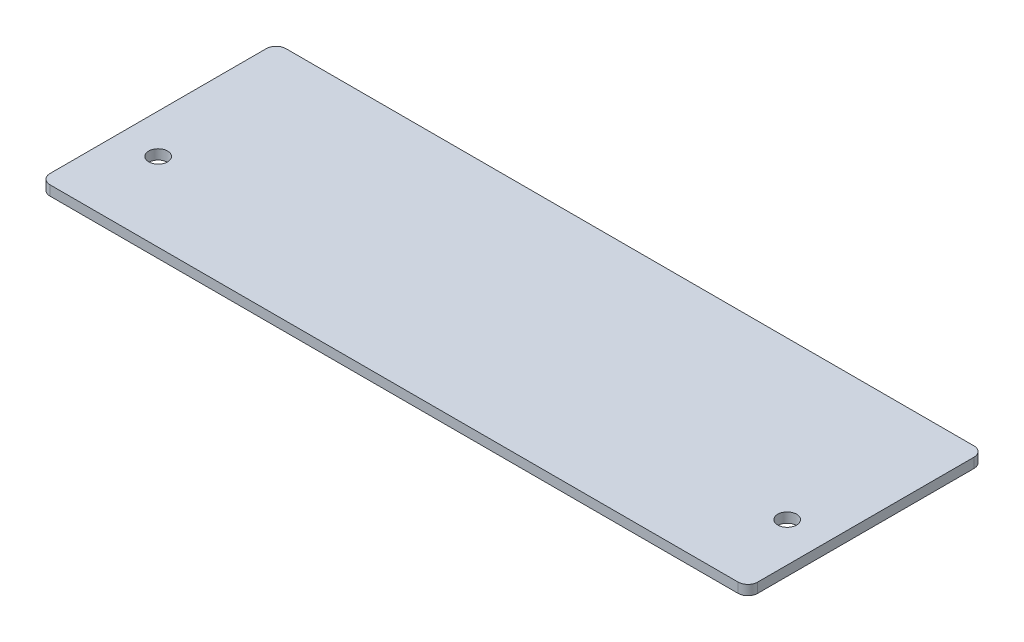
ISO-10303-21;
HEADER;
FILE_DESCRIPTION(('STEP AP214'),'2;1');
FILE_NAME('part.step','',(''),(''),'','','');
FILE_SCHEMA(('AUTOMOTIVE_DESIGN { 1 0 10303 214 1 1 1 1 }'));
ENDSEC;
DATA;
#1=APPLICATION_CONTEXT('core data for automotive mechanical design processes');
#2=APPLICATION_PROTOCOL_DEFINITION('international standard','automotive_design',2000,#1);
#3=PRODUCT_CONTEXT('',#1,'mechanical');
#4=PRODUCT('Part','Part','',(#3));
#5=PRODUCT_RELATED_PRODUCT_CATEGORY('part','',(#4));
#6=PRODUCT_DEFINITION_FORMATION('','',#4);
#7=PRODUCT_DEFINITION_CONTEXT('part definition',#1,'design');
#8=PRODUCT_DEFINITION('design','',#6,#7);
#9=PRODUCT_DEFINITION_SHAPE('','',#8);
#10=(LENGTH_UNIT() NAMED_UNIT(*) SI_UNIT(.MILLI.,.METRE.));
#11=(NAMED_UNIT(*) PLANE_ANGLE_UNIT() SI_UNIT($,.RADIAN.));
#12=(NAMED_UNIT(*) SI_UNIT($,.STERADIAN.) SOLID_ANGLE_UNIT());
#13=UNCERTAINTY_MEASURE_WITH_UNIT(LENGTH_MEASURE(1.E-05),#10,'distance_accuracy_value','');
#14=(GEOMETRIC_REPRESENTATION_CONTEXT(3) GLOBAL_UNCERTAINTY_ASSIGNED_CONTEXT((#13)) GLOBAL_UNIT_ASSIGNED_CONTEXT((#10,
#11,#12)) REPRESENTATION_CONTEXT('',''));
#15=CARTESIAN_POINT('',(0.,0.,0.));
#16=DIRECTION('',(0.,0.,1.));
#17=DIRECTION('',(1.,0.,0.));
#18=AXIS2_PLACEMENT_3D('',#15,#16,#17);
#19=CARTESIAN_POINT('',(-114.3,3.175,38.1));
#20=DIRECTION('',(1.,0.,0.));
#21=DIRECTION('',(0.,0.,-1.));
#22=AXIS2_PLACEMENT_3D('',#19,#20,#21);
#23=PLANE('',#22);
#24=DIRECTION('',(0.,0.,1.));
#25=VECTOR('',#24,1.);
#26=CARTESIAN_POINT('',(-114.3,3.175,38.1));
#27=LINE('',#26,#25);
#28=CARTESIAN_POINT('',(-114.3,3.175,-34.925));
#29=VERTEX_POINT('',#28);
#30=CARTESIAN_POINT('',(-114.3,3.175,34.925));
#31=VERTEX_POINT('',#30);
#32=EDGE_CURVE('E133',#29,#31,#27,.T.);
#33=ORIENTED_EDGE('',*,*,#32,.F.);
#34=DIRECTION('',(0.,-1.,0.));
#35=VECTOR('',#34,1.);
#36=CARTESIAN_POINT('',(-114.3,3.175,-34.925));
#37=LINE('',#36,#35);
#38=CARTESIAN_POINT('',(-114.3,0.,-34.925));
#39=VERTEX_POINT('',#38);
#40=EDGE_CURVE('E118',#29,#39,#37,.T.);
#41=ORIENTED_EDGE('',*,*,#40,.T.);
#42=DIRECTION('',(0.,0.,1.));
#43=VECTOR('',#42,1.);
#44=CARTESIAN_POINT('',(-114.3,0.,38.1));
#45=LINE('',#44,#43);
#46=CARTESIAN_POINT('',(-114.3,0.,34.925));
#47=VERTEX_POINT('',#46);
#48=EDGE_CURVE('E130',#39,#47,#45,.T.);
#49=ORIENTED_EDGE('',*,*,#48,.T.);
#50=DIRECTION('',(0.,-1.,0.));
#51=VECTOR('',#50,1.);
#52=CARTESIAN_POINT('',(-114.3,3.175,34.925));
#53=LINE('',#52,#51);
#54=EDGE_CURVE('E135',#47,#31,#53,.F.);
#55=ORIENTED_EDGE('',*,*,#54,.T.);
#56=EDGE_LOOP('',(#33,#41,#49,#55));
#57=FACE_BOUND('',#56,.T.);
#58=ADVANCED_FACE('F48',(#57),#23,.F.);
#59=CARTESIAN_POINT('',(114.3,3.175,38.1));
#60=DIRECTION('',(0.,0.,-1.));
#61=DIRECTION('',(-1.,0.,0.));
#62=AXIS2_PLACEMENT_3D('',#59,#60,#61);
#63=PLANE('',#62);
#64=DIRECTION('',(1.,0.,0.));
#65=VECTOR('',#64,1.);
#66=CARTESIAN_POINT('',(114.3,0.,38.1));
#67=LINE('',#66,#65);
#68=CARTESIAN_POINT('',(-111.125,0.,38.1));
#69=VERTEX_POINT('',#68);
#70=CARTESIAN_POINT('',(111.125,0.,38.1));
#71=VERTEX_POINT('',#70);
#72=EDGE_CURVE('E141',#69,#71,#67,.T.);
#73=ORIENTED_EDGE('',*,*,#72,.T.);
#74=DIRECTION('',(0.,-1.,0.));
#75=VECTOR('',#74,1.);
#76=CARTESIAN_POINT('',(111.125,3.175,38.1));
#77=LINE('',#76,#75);
#78=CARTESIAN_POINT('',(111.125,3.175,38.1));
#79=VERTEX_POINT('',#78);
#80=EDGE_CURVE('E12',#71,#79,#77,.F.);
#81=ORIENTED_EDGE('',*,*,#80,.T.);
#82=DIRECTION('',(1.,0.,0.));
#83=VECTOR('',#82,1.);
#84=CARTESIAN_POINT('',(114.3,3.175,38.1));
#85=LINE('',#84,#83);
#86=CARTESIAN_POINT('',(-111.125,3.175,38.1));
#87=VERTEX_POINT('',#86);
#88=EDGE_CURVE('E192',#87,#79,#85,.T.);
#89=ORIENTED_EDGE('',*,*,#88,.F.);
#90=DIRECTION('',(0.,-1.,0.));
#91=VECTOR('',#90,1.);
#92=CARTESIAN_POINT('',(-111.125,3.175,38.1));
#93=LINE('',#92,#91);
#94=EDGE_CURVE('E56',#87,#69,#93,.T.);
#95=ORIENTED_EDGE('',*,*,#94,.T.);
#96=EDGE_LOOP('',(#73,#81,#89,#95));
#97=FACE_BOUND('',#96,.T.);
#98=ADVANCED_FACE('F190',(#97),#63,.F.);
#99=CARTESIAN_POINT('',(114.3,3.175,38.1));
#100=DIRECTION('',(-1.,0.,0.));
#101=DIRECTION('',(0.,0.,1.));
#102=AXIS2_PLACEMENT_3D('',#99,#100,#101);
#103=PLANE('',#102);
#104=DIRECTION('',(0.,0.,-1.));
#105=VECTOR('',#104,1.);
#106=CARTESIAN_POINT('',(114.3,3.175,38.1));
#107=LINE('',#106,#105);
#108=CARTESIAN_POINT('',(114.3,3.175,34.925));
#109=VERTEX_POINT('',#108);
#110=CARTESIAN_POINT('',(114.3,3.175,-34.925));
#111=VERTEX_POINT('',#110);
#112=EDGE_CURVE('E200',#109,#111,#107,.T.);
#113=ORIENTED_EDGE('',*,*,#112,.F.);
#114=DIRECTION('',(0.,-1.,0.));
#115=VECTOR('',#114,1.);
#116=CARTESIAN_POINT('',(114.3,3.175,34.925));
#117=LINE('',#116,#115);
#118=CARTESIAN_POINT('',(114.3,0.,34.925));
#119=VERTEX_POINT('',#118);
#120=EDGE_CURVE('E184',#109,#119,#117,.T.);
#121=ORIENTED_EDGE('',*,*,#120,.T.);
#122=DIRECTION('',(0.,0.,-1.));
#123=VECTOR('',#122,1.);
#124=CARTESIAN_POINT('',(114.3,0.,38.1));
#125=LINE('',#124,#123);
#126=CARTESIAN_POINT('',(114.3,0.,-34.925));
#127=VERTEX_POINT('',#126);
#128=EDGE_CURVE('E148',#119,#127,#125,.T.);
#129=ORIENTED_EDGE('',*,*,#128,.T.);
#130=DIRECTION('',(0.,-1.,0.));
#131=VECTOR('',#130,1.);
#132=CARTESIAN_POINT('',(114.3,3.175,-34.925));
#133=LINE('',#132,#131);
#134=EDGE_CURVE('E63',#127,#111,#133,.F.);
#135=ORIENTED_EDGE('',*,*,#134,.T.);
#136=EDGE_LOOP('',(#113,#121,#129,#135));
#137=FACE_BOUND('',#136,.T.);
#138=ADVANCED_FACE('F199',(#137),#103,.F.);
#139=CARTESIAN_POINT('',(114.3,3.175,-38.1));
#140=DIRECTION('',(0.,0.,1.));
#141=DIRECTION('',(1.,0.,0.));
#142=AXIS2_PLACEMENT_3D('',#139,#140,#141);
#143=PLANE('',#142);
#144=DIRECTION('',(-1.,0.,0.));
#145=VECTOR('',#144,1.);
#146=CARTESIAN_POINT('',(114.3,0.,-38.1));
#147=LINE('',#146,#145);
#148=CARTESIAN_POINT('',(111.125,0.,-38.1));
#149=VERTEX_POINT('',#148);
#150=CARTESIAN_POINT('',(-111.125,0.,-38.1));
#151=VERTEX_POINT('',#150);
#152=EDGE_CURVE('E158',#149,#151,#147,.T.);
#153=ORIENTED_EDGE('',*,*,#152,.T.);
#154=DIRECTION('',(0.,-1.,0.));
#155=VECTOR('',#154,1.);
#156=CARTESIAN_POINT('',(-111.125,3.175,-38.1));
#157=LINE('',#156,#155);
#158=CARTESIAN_POINT('',(-111.125,3.175,-38.1));
#159=VERTEX_POINT('',#158);
#160=EDGE_CURVE('E119',#151,#159,#157,.F.);
#161=ORIENTED_EDGE('',*,*,#160,.T.);
#162=DIRECTION('',(-1.,0.,0.));
#163=VECTOR('',#162,1.);
#164=CARTESIAN_POINT('',(114.3,3.175,-38.1));
#165=LINE('',#164,#163);
#166=CARTESIAN_POINT('',(111.125,3.175,-38.1));
#167=VERTEX_POINT('',#166);
#168=EDGE_CURVE('E155',#167,#159,#165,.T.);
#169=ORIENTED_EDGE('',*,*,#168,.F.);
#170=DIRECTION('',(0.,-1.,0.));
#171=VECTOR('',#170,1.);
#172=CARTESIAN_POINT('',(111.125,3.175,-38.1));
#173=LINE('',#172,#171);
#174=EDGE_CURVE('E124',#167,#149,#173,.T.);
#175=ORIENTED_EDGE('',*,*,#174,.T.);
#176=EDGE_LOOP('',(#153,#161,#169,#175));
#177=FACE_BOUND('',#176,.T.);
#178=ADVANCED_FACE('F220',(#177),#143,.F.);
#179=CARTESIAN_POINT('',(0.,3.175,0.));
#180=DIRECTION('',(0.,1.,0.));
#181=DIRECTION('',(0.,0.,1.));
#182=AXIS2_PLACEMENT_3D('',#179,#180,#181);
#183=PLANE('',#182);
#184=CARTESIAN_POINT('',(-101.6,3.175,12.7));
#185=DIRECTION('',(0.,1.,0.));
#186=DIRECTION('',(0.,0.,1.));
#187=AXIS2_PLACEMENT_3D('',#184,#185,#186);
#188=CIRCLE('',#187,3.048);
#189=CARTESIAN_POINT('',(-101.6,3.175,15.748));
#190=VERTEX_POINT('',#189);
#191=EDGE_CURVE('E165',#190,#190,#188,.T.);
#192=ORIENTED_EDGE('',*,*,#191,.F.);
#193=EDGE_LOOP('',(#192));
#194=FACE_BOUND('',#193,.T.);
#195=CARTESIAN_POINT('',(101.6,3.175,12.7));
#196=DIRECTION('',(0.,1.,0.));
#197=DIRECTION('',(0.,0.,-1.));
#198=AXIS2_PLACEMENT_3D('',#195,#196,#197);
#199=CIRCLE('',#198,3.048);
#200=CARTESIAN_POINT('',(101.6,3.175,9.652));
#201=VERTEX_POINT('',#200);
#202=EDGE_CURVE('E206',#201,#201,#199,.T.);
#203=ORIENTED_EDGE('',*,*,#202,.F.);
#204=EDGE_LOOP('',(#203));
#205=FACE_BOUND('',#204,.T.);
#206=ORIENTED_EDGE('',*,*,#168,.T.);
#207=CARTESIAN_POINT('',(-111.125,3.175,-34.925));
#208=DIRECTION('',(0.,1.,0.));
#209=DIRECTION('',(0.,0.,1.));
#210=AXIS2_PLACEMENT_3D('',#207,#208,#209);
#211=CIRCLE('',#210,3.175);
#212=EDGE_CURVE('E181',#159,#29,#211,.T.);
#213=ORIENTED_EDGE('',*,*,#212,.T.);
#214=ORIENTED_EDGE('',*,*,#32,.T.);
#215=CARTESIAN_POINT('',(-111.125,3.175,34.925));
#216=DIRECTION('',(0.,1.,0.));
#217=DIRECTION('',(0.,0.,1.));
#218=AXIS2_PLACEMENT_3D('',#215,#216,#217);
#219=CIRCLE('',#218,3.175);
#220=EDGE_CURVE('E178',#31,#87,#219,.T.);
#221=ORIENTED_EDGE('',*,*,#220,.T.);
#222=ORIENTED_EDGE('',*,*,#88,.T.);
#223=CARTESIAN_POINT('',(111.125,3.175,34.925));
#224=DIRECTION('',(0.,1.,0.));
#225=DIRECTION('',(0.,0.,1.));
#226=AXIS2_PLACEMENT_3D('',#223,#224,#225);
#227=CIRCLE('',#226,3.175);
#228=EDGE_CURVE('E70',#79,#109,#227,.T.);
#229=ORIENTED_EDGE('',*,*,#228,.T.);
#230=ORIENTED_EDGE('',*,*,#112,.T.);
#231=CARTESIAN_POINT('',(111.125,3.175,-34.925));
#232=DIRECTION('',(0.,1.,0.));
#233=DIRECTION('',(0.,0.,1.));
#234=AXIS2_PLACEMENT_3D('',#231,#232,#233);
#235=CIRCLE('',#234,3.175);
#236=EDGE_CURVE('E176',#111,#167,#235,.T.);
#237=ORIENTED_EDGE('',*,*,#236,.T.);
#238=EDGE_LOOP('',(#206,#213,#214,#221,#222,#229,#230,#237));
#239=FACE_BOUND('',#238,.T.);
#240=ADVANCED_FACE('F216',(#194,#205,#239),#183,.T.);
#241=CARTESIAN_POINT('',(0.,0.,0.));
#242=DIRECTION('',(0.,1.,0.));
#243=DIRECTION('',(0.,0.,1.));
#244=AXIS2_PLACEMENT_3D('',#241,#242,#243);
#245=PLANE('',#244);
#246=CARTESIAN_POINT('',(-101.6,0.,12.7));
#247=DIRECTION('',(0.,1.,0.));
#248=DIRECTION('',(0.,0.,1.));
#249=AXIS2_PLACEMENT_3D('',#246,#247,#248);
#250=CIRCLE('',#249,3.048);
#251=CARTESIAN_POINT('',(-101.6,0.,15.748));
#252=VERTEX_POINT('',#251);
#253=EDGE_CURVE('E142',#252,#252,#250,.T.);
#254=ORIENTED_EDGE('',*,*,#253,.T.);
#255=EDGE_LOOP('',(#254));
#256=FACE_BOUND('',#255,.T.);
#257=CARTESIAN_POINT('',(101.6,0.,12.7));
#258=DIRECTION('',(0.,1.,0.));
#259=DIRECTION('',(0.,0.,1.));
#260=AXIS2_PLACEMENT_3D('',#257,#258,#259);
#261=CIRCLE('',#260,3.048);
#262=CARTESIAN_POINT('',(101.6,0.,15.748));
#263=VERTEX_POINT('',#262);
#264=EDGE_CURVE('E152',#263,#263,#261,.T.);
#265=ORIENTED_EDGE('',*,*,#264,.T.);
#266=EDGE_LOOP('',(#265));
#267=FACE_BOUND('',#266,.T.);
#268=ORIENTED_EDGE('',*,*,#48,.F.);
#269=CARTESIAN_POINT('',(-111.125,0.,-34.925));
#270=DIRECTION('',(0.,1.,0.));
#271=DIRECTION('',(0.,0.,1.));
#272=AXIS2_PLACEMENT_3D('',#269,#270,#271);
#273=CIRCLE('',#272,3.175);
#274=EDGE_CURVE('E114',#39,#151,#273,.F.);
#275=ORIENTED_EDGE('',*,*,#274,.T.);
#276=ORIENTED_EDGE('',*,*,#152,.F.);
#277=CARTESIAN_POINT('',(111.125,0.,-34.925));
#278=DIRECTION('',(0.,1.,0.));
#279=DIRECTION('',(0.,0.,1.));
#280=AXIS2_PLACEMENT_3D('',#277,#278,#279);
#281=CIRCLE('',#280,3.175);
#282=EDGE_CURVE('E134',#149,#127,#281,.F.);
#283=ORIENTED_EDGE('',*,*,#282,.T.);
#284=ORIENTED_EDGE('',*,*,#128,.F.);
#285=CARTESIAN_POINT('',(111.125,0.,34.925));
#286=DIRECTION('',(0.,1.,0.));
#287=DIRECTION('',(0.,0.,1.));
#288=AXIS2_PLACEMENT_3D('',#285,#286,#287);
#289=CIRCLE('',#288,3.175);
#290=EDGE_CURVE('E125',#119,#71,#289,.F.);
#291=ORIENTED_EDGE('',*,*,#290,.T.);
#292=ORIENTED_EDGE('',*,*,#72,.F.);
#293=CARTESIAN_POINT('',(-111.125,0.,34.925));
#294=DIRECTION('',(0.,1.,0.));
#295=DIRECTION('',(0.,0.,1.));
#296=AXIS2_PLACEMENT_3D('',#293,#294,#295);
#297=CIRCLE('',#296,3.175);
#298=EDGE_CURVE('E139',#69,#47,#297,.F.);
#299=ORIENTED_EDGE('',*,*,#298,.T.);
#300=EDGE_LOOP('',(#268,#275,#276,#283,#284,#291,#292,#299));
#301=FACE_BOUND('',#300,.T.);
#302=ADVANCED_FACE('F137',(#256,#267,#301),#245,.F.);
#303=CARTESIAN_POINT('',(101.6,-6.825,12.7));
#304=DIRECTION('',(0.,1.,0.));
#305=DIRECTION('',(0.,0.,1.));
#306=AXIS2_PLACEMENT_3D('',#303,#304,#305);
#307=CYLINDRICAL_SURFACE('',#306,3.048);
#308=ORIENTED_EDGE('',*,*,#202,.T.);
#309=EDGE_LOOP('',(#308));
#310=FACE_BOUND('',#309,.T.);
#311=ORIENTED_EDGE('',*,*,#264,.F.);
#312=EDGE_LOOP('',(#311));
#313=FACE_BOUND('',#312,.T.);
#314=ADVANCED_FACE('F276',(#310,#313),#307,.F.);
#315=CARTESIAN_POINT('',(-101.6,-6.825,12.7));
#316=DIRECTION('',(0.,1.,0.));
#317=DIRECTION('',(0.,0.,1.));
#318=AXIS2_PLACEMENT_3D('',#315,#316,#317);
#319=CYLINDRICAL_SURFACE('',#318,3.048);
#320=ORIENTED_EDGE('',*,*,#191,.T.);
#321=EDGE_LOOP('',(#320));
#322=FACE_BOUND('',#321,.T.);
#323=ORIENTED_EDGE('',*,*,#253,.F.);
#324=EDGE_LOOP('',(#323));
#325=FACE_BOUND('',#324,.T.);
#326=ADVANCED_FACE('F212',(#322,#325),#319,.F.);
#327=CARTESIAN_POINT('',(-111.125,3.175,-34.925));
#328=DIRECTION('',(0.,-1.,0.));
#329=DIRECTION('',(0.,0.,-1.));
#330=AXIS2_PLACEMENT_3D('',#327,#328,#329);
#331=CYLINDRICAL_SURFACE('',#330,3.175);
#332=ORIENTED_EDGE('',*,*,#212,.F.);
#333=ORIENTED_EDGE('',*,*,#160,.F.);
#334=ORIENTED_EDGE('',*,*,#274,.F.);
#335=ORIENTED_EDGE('',*,*,#40,.F.);
#336=EDGE_LOOP('',(#332,#333,#334,#335));
#337=FACE_BOUND('',#336,.T.);
#338=ADVANCED_FACE('F117',(#337),#331,.T.);
#339=CARTESIAN_POINT('',(111.125,3.175,34.925));
#340=DIRECTION('',(0.,-1.,0.));
#341=DIRECTION('',(0.,0.,-1.));
#342=AXIS2_PLACEMENT_3D('',#339,#340,#341);
#343=CYLINDRICAL_SURFACE('',#342,3.175);
#344=ORIENTED_EDGE('',*,*,#228,.F.);
#345=ORIENTED_EDGE('',*,*,#80,.F.);
#346=ORIENTED_EDGE('',*,*,#290,.F.);
#347=ORIENTED_EDGE('',*,*,#120,.F.);
#348=EDGE_LOOP('',(#344,#345,#346,#347));
#349=FACE_BOUND('',#348,.T.);
#350=ADVANCED_FACE('F198',(#349),#343,.T.);
#351=CARTESIAN_POINT('',(-111.125,3.175,34.925));
#352=DIRECTION('',(0.,-1.,0.));
#353=DIRECTION('',(0.,0.,-1.));
#354=AXIS2_PLACEMENT_3D('',#351,#352,#353);
#355=CYLINDRICAL_SURFACE('',#354,3.175);
#356=ORIENTED_EDGE('',*,*,#220,.F.);
#357=ORIENTED_EDGE('',*,*,#54,.F.);
#358=ORIENTED_EDGE('',*,*,#298,.F.);
#359=ORIENTED_EDGE('',*,*,#94,.F.);
#360=EDGE_LOOP('',(#356,#357,#358,#359));
#361=FACE_BOUND('',#360,.T.);
#362=ADVANCED_FACE('F228',(#361),#355,.T.);
#363=CARTESIAN_POINT('',(111.125,3.175,-34.925));
#364=DIRECTION('',(0.,-1.,0.));
#365=DIRECTION('',(0.,0.,-1.));
#366=AXIS2_PLACEMENT_3D('',#363,#364,#365);
#367=CYLINDRICAL_SURFACE('',#366,3.175);
#368=ORIENTED_EDGE('',*,*,#236,.F.);
#369=ORIENTED_EDGE('',*,*,#134,.F.);
#370=ORIENTED_EDGE('',*,*,#282,.F.);
#371=ORIENTED_EDGE('',*,*,#174,.F.);
#372=EDGE_LOOP('',(#368,#369,#370,#371));
#373=FACE_BOUND('',#372,.T.);
#374=ADVANCED_FACE('F50',(#373),#367,.T.);
#375=CLOSED_SHELL('',(#58,#98,#138,#178,#240,#302,#314,#326,#338,#350,#362,#374));
#376=MANIFOLD_SOLID_BREP('B2',#375);
#377=ADVANCED_BREP_SHAPE_REPRESENTATION('',(#18,#376),#14);
#378=SHAPE_DEFINITION_REPRESENTATION(#9,#377);
ENDSEC;
END-ISO-10303-21;
